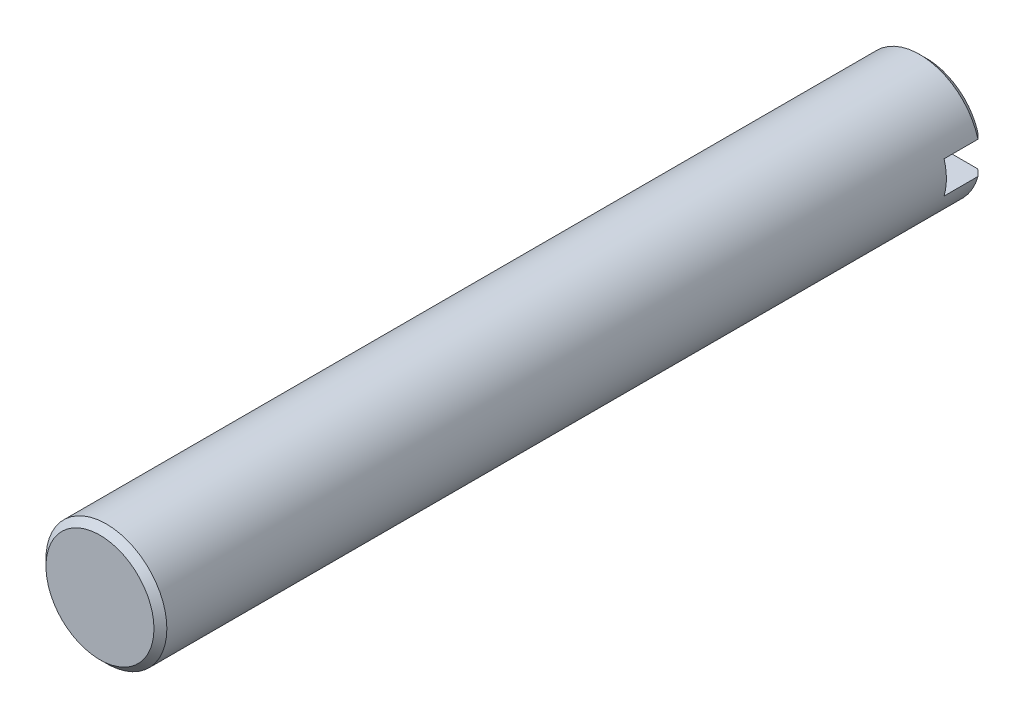
ISO-10303-21;
HEADER;
FILE_DESCRIPTION(('STEP AP214'),'2;1');
FILE_NAME('part.step','',(''),(''),'','','');
FILE_SCHEMA(('AUTOMOTIVE_DESIGN { 1 0 10303 214 1 1 1 1 }'));
ENDSEC;
DATA;
#1=APPLICATION_CONTEXT('core data for automotive mechanical design processes');
#2=APPLICATION_PROTOCOL_DEFINITION('international standard','automotive_design',2000,#1);
#3=PRODUCT_CONTEXT('',#1,'mechanical');
#4=PRODUCT('Part','Part','',(#3));
#5=PRODUCT_RELATED_PRODUCT_CATEGORY('part','',(#4));
#6=PRODUCT_DEFINITION_FORMATION('','',#4);
#7=PRODUCT_DEFINITION_CONTEXT('part definition',#1,'design');
#8=PRODUCT_DEFINITION('design','',#6,#7);
#9=PRODUCT_DEFINITION_SHAPE('','',#8);
#10=(LENGTH_UNIT() NAMED_UNIT(*) SI_UNIT(.MILLI.,.METRE.));
#11=(NAMED_UNIT(*) PLANE_ANGLE_UNIT() SI_UNIT($,.RADIAN.));
#12=(NAMED_UNIT(*) SI_UNIT($,.STERADIAN.) SOLID_ANGLE_UNIT());
#13=UNCERTAINTY_MEASURE_WITH_UNIT(LENGTH_MEASURE(1.E-05),#10,'distance_accuracy_value','');
#14=(GEOMETRIC_REPRESENTATION_CONTEXT(3) GLOBAL_UNCERTAINTY_ASSIGNED_CONTEXT((#13)) GLOBAL_UNIT_ASSIGNED_CONTEXT((#10,
#11,#12)) REPRESENTATION_CONTEXT('',''));
#15=CARTESIAN_POINT('',(0.,0.,0.));
#16=DIRECTION('',(0.,0.,1.));
#17=DIRECTION('',(1.,0.,0.));
#18=AXIS2_PLACEMENT_3D('',#15,#16,#17);
#19=CARTESIAN_POINT('',(-9.3281143692604,3.25223446928268,0.));
#20=DIRECTION('',(0.,0.,1.));
#21=DIRECTION('',(1.,0.,0.));
#22=AXIS2_PLACEMENT_3D('',#19,#20,#21);
#23=PLANE('',#22);
#24=DIRECTION('',(1.,0.,0.));
#25=VECTOR('',#24,1.);
#26=CARTESIAN_POINT('',(-9.3281143692604,1.98223446928268,0.));
#27=LINE('',#26,#25);
#28=CARTESIAN_POINT('',(-13.3886402280624,1.98223446928268,0.));
#29=VERTEX_POINT('',#28);
#30=CARTESIAN_POINT('',(-5.26758851045836,1.98223446928268,0.));
#31=VERTEX_POINT('',#30);
#32=EDGE_CURVE('E113',#29,#31,#27,.T.);
#33=ORIENTED_EDGE('',*,*,#32,.T.);
#34=CARTESIAN_POINT('',(-9.3281143692604,3.25223446928268,0.));
#35=DIRECTION('',(0.,0.,1.));
#36=DIRECTION('',(1.,0.,0.));
#37=AXIS2_PLACEMENT_3D('',#34,#35,#36);
#38=CIRCLE('',#37,4.25450000000001);
#39=EDGE_CURVE('E58',#31,#29,#38,.F.);
#40=ORIENTED_EDGE('',*,*,#39,.T.);
#41=EDGE_LOOP('',(#33,#40));
#42=FACE_BOUND('',#41,.T.);
#43=ADVANCED_FACE('F37',(#42),#23,.F.);
#44=CARTESIAN_POINT('',(-9.3281143692604,3.25223446928268,65.1002));
#45=DIRECTION('',(0.,0.,-1.));
#46=DIRECTION('',(-1.,0.,0.));
#47=AXIS2_PLACEMENT_3D('',#44,#45,#46);
#48=CYLINDRICAL_SURFACE('',#47,4.7625);
#49=CARTESIAN_POINT('',(-9.3281143692604,3.25223446928268,64.5922));
#50=DIRECTION('',(0.,0.,1.));
#51=DIRECTION('',(1.,0.,0.));
#52=AXIS2_PLACEMENT_3D('',#49,#50,#51);
#53=CIRCLE('',#52,4.7625);
#54=CARTESIAN_POINT('',(-4.5656143692604,3.25223446928268,64.5922));
#55=VERTEX_POINT('',#54);
#56=EDGE_CURVE('E11',#55,#55,#53,.F.);
#57=ORIENTED_EDGE('',*,*,#56,.T.);
#58=EDGE_LOOP('',(#57));
#59=FACE_BOUND('',#58,.T.);
#60=DIRECTION('',(0.,0.,-1.));
#61=VECTOR('',#60,1.);
#62=CARTESIAN_POINT('',(-13.9181586228597,1.98223446928268,65.1002));
#63=LINE('',#62,#61);
#64=CARTESIAN_POINT('',(-13.9181586228597,1.98223446928268,3.175));
#65=VERTEX_POINT('',#64);
#66=CARTESIAN_POINT('',(-13.9181586228597,1.98223446928268,0.507999999999995));
#67=VERTEX_POINT('',#66);
#68=EDGE_CURVE('E122',#65,#67,#63,.T.);
#69=ORIENTED_EDGE('',*,*,#68,.T.);
#70=CARTESIAN_POINT('',(-9.3281143692604,3.25223446928268,0.507999999999995));
#71=DIRECTION('',(0.,0.,1.));
#72=DIRECTION('',(1.,0.,0.));
#73=AXIS2_PLACEMENT_3D('',#70,#71,#72);
#74=CIRCLE('',#73,4.7625);
#75=CARTESIAN_POINT('',(-4.73807011566109,1.98223446928268,0.507999999999995));
#76=VERTEX_POINT('',#75);
#77=EDGE_CURVE('E197',#67,#76,#74,.T.);
#78=ORIENTED_EDGE('',*,*,#77,.T.);
#79=DIRECTION('',(0.,0.,-1.));
#80=VECTOR('',#79,1.);
#81=CARTESIAN_POINT('',(-4.73807011566109,1.98223446928268,65.1002));
#82=LINE('',#81,#80);
#83=CARTESIAN_POINT('',(-4.73807011566109,1.98223446928268,3.175));
#84=VERTEX_POINT('',#83);
#85=EDGE_CURVE('E120',#76,#84,#82,.F.);
#86=ORIENTED_EDGE('',*,*,#85,.T.);
#87=CARTESIAN_POINT('',(-9.3281143692604,3.25223446928268,3.175));
#88=DIRECTION('',(0.,0.,-1.));
#89=DIRECTION('',(-1.,0.,0.));
#90=AXIS2_PLACEMENT_3D('',#87,#88,#89);
#91=CIRCLE('',#90,4.7625);
#92=CARTESIAN_POINT('',(-4.73807011566109,4.52223446928268,3.175));
#93=VERTEX_POINT('',#92);
#94=EDGE_CURVE('E112',#93,#84,#91,.T.);
#95=ORIENTED_EDGE('',*,*,#94,.F.);
#96=DIRECTION('',(0.,0.,-1.));
#97=VECTOR('',#96,1.);
#98=CARTESIAN_POINT('',(-4.73807011566109,4.52223446928268,65.1002));
#99=LINE('',#98,#97);
#100=CARTESIAN_POINT('',(-4.73807011566109,4.52223446928268,0.507999999999995));
#101=VERTEX_POINT('',#100);
#102=EDGE_CURVE('E101',#93,#101,#99,.T.);
#103=ORIENTED_EDGE('',*,*,#102,.T.);
#104=CARTESIAN_POINT('',(-9.3281143692604,3.25223446928268,0.507999999999995));
#105=DIRECTION('',(0.,0.,1.));
#106=DIRECTION('',(1.,0.,0.));
#107=AXIS2_PLACEMENT_3D('',#104,#105,#106);
#108=CIRCLE('',#107,4.7625);
#109=CARTESIAN_POINT('',(-13.9181586228597,4.52223446928268,0.507999999999995));
#110=VERTEX_POINT('',#109);
#111=EDGE_CURVE('E98',#101,#110,#108,.T.);
#112=ORIENTED_EDGE('',*,*,#111,.T.);
#113=DIRECTION('',(0.,0.,-1.));
#114=VECTOR('',#113,1.);
#115=CARTESIAN_POINT('',(-13.9181586228597,4.52223446928268,65.1002));
#116=LINE('',#115,#114);
#117=CARTESIAN_POINT('',(-13.9181586228597,4.52223446928268,3.175));
#118=VERTEX_POINT('',#117);
#119=EDGE_CURVE('E91',#110,#118,#116,.F.);
#120=ORIENTED_EDGE('',*,*,#119,.T.);
#121=EDGE_CURVE('E95',#65,#118,#91,.T.);
#122=ORIENTED_EDGE('',*,*,#121,.F.);
#123=EDGE_LOOP('',(#69,#78,#86,#95,#103,#112,#120,#122));
#124=FACE_BOUND('',#123,.T.);
#125=ADVANCED_FACE('F94',(#59,#124),#48,.T.);
#126=CARTESIAN_POINT('',(-9.3281143692604,3.25223446928268,65.1002));
#127=DIRECTION('',(0.,0.,1.));
#128=DIRECTION('',(1.,0.,0.));
#129=AXIS2_PLACEMENT_3D('',#126,#127,#128);
#130=PLANE('',#129);
#131=CARTESIAN_POINT('',(-9.3281143692604,3.25223446928268,65.1002));
#132=DIRECTION('',(0.,0.,1.));
#133=DIRECTION('',(1.,0.,0.));
#134=AXIS2_PLACEMENT_3D('',#131,#132,#133);
#135=CIRCLE('',#134,4.25450000000002);
#136=CARTESIAN_POINT('',(-5.07361436926039,3.25223446928268,65.1002));
#137=VERTEX_POINT('',#136);
#138=EDGE_CURVE('E45',#137,#137,#135,.T.);
#139=ORIENTED_EDGE('',*,*,#138,.T.);
#140=EDGE_LOOP('',(#139));
#141=FACE_BOUND('',#140,.T.);
#142=ADVANCED_FACE('F153',(#141),#130,.T.);
#143=DIRECTION('',(-1.,0.,0.));
#144=VECTOR('',#143,1.);
#145=CARTESIAN_POINT('',(-9.3281143692604,4.52223446928268,0.));
#146=LINE('',#145,#144);
#147=CARTESIAN_POINT('',(-5.26758851045836,4.52223446928268,0.));
#148=VERTEX_POINT('',#147);
#149=CARTESIAN_POINT('',(-13.3886402280624,4.52223446928268,0.));
#150=VERTEX_POINT('',#149);
#151=EDGE_CURVE('E124',#148,#150,#146,.T.);
#152=ORIENTED_EDGE('',*,*,#151,.T.);
#153=CARTESIAN_POINT('',(-9.3281143692604,3.25223446928268,0.));
#154=DIRECTION('',(0.,0.,1.));
#155=DIRECTION('',(1.,0.,0.));
#156=AXIS2_PLACEMENT_3D('',#153,#154,#155);
#157=CIRCLE('',#156,4.25450000000001);
#158=EDGE_CURVE('E198',#150,#148,#157,.F.);
#159=ORIENTED_EDGE('',*,*,#158,.T.);
#160=EDGE_LOOP('',(#152,#159));
#161=FACE_BOUND('',#160,.T.);
#162=ADVANCED_FACE('F157',(#161),#23,.F.);
#163=CARTESIAN_POINT('',(0.,0.,3.175));
#164=DIRECTION('',(0.,0.,-1.));
#165=DIRECTION('',(-1.,0.,0.));
#166=AXIS2_PLACEMENT_3D('',#163,#164,#165);
#167=PLANE('',#166);
#168=ORIENTED_EDGE('',*,*,#94,.T.);
#169=DIRECTION('',(-1.,0.,0.));
#170=VECTOR('',#169,1.);
#171=CARTESIAN_POINT('',(-3.83928500552411,1.98223446928268,3.175));
#172=LINE('',#171,#170);
#173=EDGE_CURVE('E102',#84,#65,#172,.T.);
#174=ORIENTED_EDGE('',*,*,#173,.T.);
#175=ORIENTED_EDGE('',*,*,#121,.T.);
#176=DIRECTION('',(1.,0.,0.));
#177=VECTOR('',#176,1.);
#178=CARTESIAN_POINT('',(-3.83928500552411,4.52223446928268,3.175));
#179=LINE('',#178,#177);
#180=EDGE_CURVE('E109',#118,#93,#179,.T.);
#181=ORIENTED_EDGE('',*,*,#180,.T.);
#182=EDGE_LOOP('',(#168,#174,#175,#181));
#183=FACE_BOUND('',#182,.T.);
#184=ADVANCED_FACE('F108',(#183),#167,.T.);
#185=CARTESIAN_POINT('',(-3.83928500552411,1.98223446928268,3.175));
#186=DIRECTION('',(0.,-1.,0.));
#187=DIRECTION('',(0.,0.,-1.));
#188=AXIS2_PLACEMENT_3D('',#185,#186,#187);
#189=PLANE('',#188);
#190=ORIENTED_EDGE('',*,*,#85,.F.);
#191=CARTESIAN_POINT('',(-4.73807011566109,1.98223446928268,0.507999999999995));
#192=CARTESIAN_POINT('',(-4.82611702096358,1.98223446928268,0.423118454827861));
#193=CARTESIAN_POINT('',(-4.91426700282083,1.98223446928268,0.338344352434885));
#194=CARTESIAN_POINT('',(-5.09077313438548,1.98223446928268,0.169011019065662));
#195=CARTESIAN_POINT('',(-5.17912928412732,1.98223446928268,0.0844517881253065));
#196=CARTESIAN_POINT('',(-5.26758851045836,1.98223446928268,0.));
#197=B_SPLINE_CURVE_WITH_KNOTS('',3,(#191,#192,#193,#194,#195,#196),.UNSPECIFIED.,.F.,.F.,(4,2,
4),(0.,0.366897273963324,0.733794609208258),.UNSPECIFIED.);
#198=EDGE_CURVE('E52',#76,#31,#197,.T.);
#199=ORIENTED_EDGE('',*,*,#198,.T.);
#200=ORIENTED_EDGE('',*,*,#32,.F.);
#201=CARTESIAN_POINT('',(-13.3886402280624,1.98223446928268,0.));
#202=CARTESIAN_POINT('',(-13.4770994543935,1.98223446928268,0.0844517881253064));
#203=CARTESIAN_POINT('',(-13.5654556041353,1.98223446928268,0.169011019065662));
#204=CARTESIAN_POINT('',(-13.7419617357,1.98223446928268,0.338344352434885));
#205=CARTESIAN_POINT('',(-13.8301117175572,1.98223446928268,0.423118454827861));
#206=CARTESIAN_POINT('',(-13.9181586228597,1.98223446928268,0.507999999999995));
#207=B_SPLINE_CURVE_WITH_KNOTS('',3,(#201,#202,#203,#204,#205,#206),.UNSPECIFIED.,.F.,.F.,(4,2,
4),(0.,0.366897335244935,0.733794609208258),.UNSPECIFIED.);
#208=EDGE_CURVE('E180',#29,#67,#207,.T.);
#209=ORIENTED_EDGE('',*,*,#208,.T.);
#210=ORIENTED_EDGE('',*,*,#68,.F.);
#211=ORIENTED_EDGE('',*,*,#173,.F.);
#212=EDGE_LOOP('',(#190,#199,#200,#209,#210,#211));
#213=FACE_BOUND('',#212,.T.);
#214=ADVANCED_FACE('F150',(#213),#189,.F.);
#215=CARTESIAN_POINT('',(-3.83928500552411,4.52223446928268,3.175));
#216=DIRECTION('',(0.,1.,0.));
#217=DIRECTION('',(0.,0.,1.));
#218=AXIS2_PLACEMENT_3D('',#215,#216,#217);
#219=PLANE('',#218);
#220=ORIENTED_EDGE('',*,*,#119,.F.);
#221=CARTESIAN_POINT('',(-13.9181586228597,4.52223446928268,0.507999999999995));
#222=CARTESIAN_POINT('',(-13.8301117175572,4.52223446928268,0.423118454827861));
#223=CARTESIAN_POINT('',(-13.7419617357,4.52223446928268,0.338344352434885));
#224=CARTESIAN_POINT('',(-13.5654556041353,4.52223446928268,0.169011019065662));
#225=CARTESIAN_POINT('',(-13.4770994543935,4.52223446928268,0.0844517881253065));
#226=CARTESIAN_POINT('',(-13.3886402280624,4.52223446928268,0.));
#227=B_SPLINE_CURVE_WITH_KNOTS('',3,(#221,#222,#223,#224,#225,#226),.UNSPECIFIED.,.F.,.F.,(4,2,
4),(0.,0.366897273963323,0.733794609208258),.UNSPECIFIED.);
#228=EDGE_CURVE('E137',#110,#150,#227,.T.);
#229=ORIENTED_EDGE('',*,*,#228,.T.);
#230=ORIENTED_EDGE('',*,*,#151,.F.);
#231=CARTESIAN_POINT('',(-5.26758851045836,4.52223446928268,0.));
#232=CARTESIAN_POINT('',(-5.17912928412732,4.52223446928268,0.084451788125306));
#233=CARTESIAN_POINT('',(-5.09077313438548,4.52223446928268,0.169011019065661));
#234=CARTESIAN_POINT('',(-4.91426700282083,4.52223446928268,0.338344352434884));
#235=CARTESIAN_POINT('',(-4.82611702096358,4.52223446928268,0.423118454827861));
#236=CARTESIAN_POINT('',(-4.73807011566109,4.52223446928268,0.507999999999995));
#237=B_SPLINE_CURVE_WITH_KNOTS('',3,(#231,#232,#233,#234,#235,#236),.UNSPECIFIED.,.F.,.F.,(4,2,
4),(0.,0.366897335244934,0.733794609208259),.UNSPECIFIED.);
#238=EDGE_CURVE('E129',#148,#101,#237,.T.);
#239=ORIENTED_EDGE('',*,*,#238,.T.);
#240=ORIENTED_EDGE('',*,*,#102,.F.);
#241=ORIENTED_EDGE('',*,*,#180,.F.);
#242=EDGE_LOOP('',(#220,#229,#230,#239,#240,#241));
#243=FACE_BOUND('',#242,.T.);
#244=ADVANCED_FACE('F115',(#243),#219,.F.);
#245=CARTESIAN_POINT('',(-9.3281143692604,3.25223446928268,0.507999999999995));
#246=DIRECTION('',(0.,0.,1.));
#247=DIRECTION('',(1.,0.,0.));
#248=AXIS2_PLACEMENT_3D('',#245,#246,#247);
#249=CONICAL_SURFACE('',#248,4.7625,0.785398163397447);
#250=ORIENTED_EDGE('',*,*,#238,.F.);
#251=ORIENTED_EDGE('',*,*,#158,.F.);
#252=ORIENTED_EDGE('',*,*,#228,.F.);
#253=ORIENTED_EDGE('',*,*,#111,.F.);
#254=EDGE_LOOP('',(#250,#251,#252,#253));
#255=FACE_BOUND('',#254,.T.);
#256=ADVANCED_FACE('F143',(#255),#249,.T.);
#257=CARTESIAN_POINT('',(-9.3281143692604,3.25223446928268,0.507999999999995));
#258=DIRECTION('',(0.,0.,1.));
#259=DIRECTION('',(1.,0.,0.));
#260=AXIS2_PLACEMENT_3D('',#257,#258,#259);
#261=CONICAL_SURFACE('',#260,4.7625,0.785398163397447);
#262=ORIENTED_EDGE('',*,*,#208,.F.);
#263=ORIENTED_EDGE('',*,*,#39,.F.);
#264=ORIENTED_EDGE('',*,*,#198,.F.);
#265=ORIENTED_EDGE('',*,*,#77,.F.);
#266=EDGE_LOOP('',(#262,#263,#264,#265));
#267=FACE_BOUND('',#266,.T.);
#268=ADVANCED_FACE('F170',(#267),#261,.T.);
#269=CARTESIAN_POINT('',(-9.3281143692604,3.25223446928268,65.1002));
#270=DIRECTION('',(0.,0.,-1.));
#271=DIRECTION('',(-1.,0.,0.));
#272=AXIS2_PLACEMENT_3D('',#269,#270,#271);
#273=CONICAL_SURFACE('',#272,4.25450000000002,0.785398163397453);
#274=ORIENTED_EDGE('',*,*,#56,.F.);
#275=EDGE_LOOP('',(#274));
#276=FACE_BOUND('',#275,.T.);
#277=ORIENTED_EDGE('',*,*,#138,.F.);
#278=EDGE_LOOP('',(#277));
#279=FACE_BOUND('',#278,.T.);
#280=ADVANCED_FACE('F39',(#276,#279),#273,.T.);
#281=CLOSED_SHELL('',(#43,#125,#142,#162,#184,#214,#244,#256,#268,#280));
#282=MANIFOLD_SOLID_BREP('B2',#281);
#283=ADVANCED_BREP_SHAPE_REPRESENTATION('',(#18,#282),#14);
#284=SHAPE_DEFINITION_REPRESENTATION(#9,#283);
ENDSEC;
END-ISO-10303-21;
